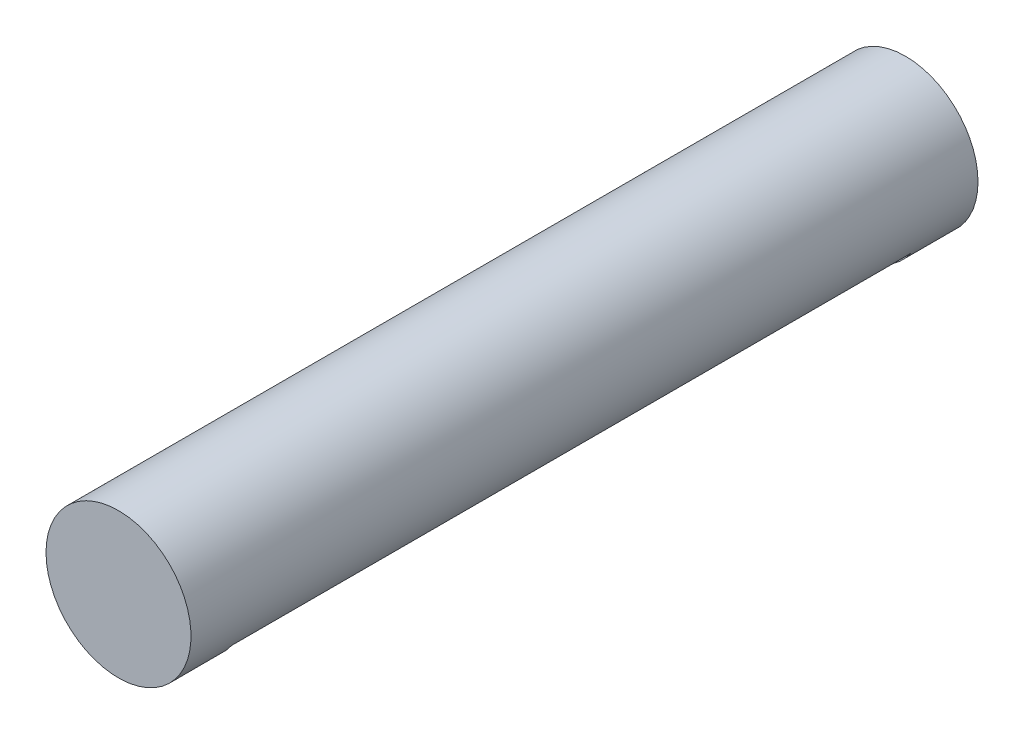
ISO-10303-21;
HEADER;
FILE_DESCRIPTION(('STEP AP214'),'2;1');
FILE_NAME('part.step','',(''),(''),'','','');
FILE_SCHEMA(('AUTOMOTIVE_DESIGN { 1 0 10303 214 1 1 1 1 }'));
ENDSEC;
DATA;
#1=APPLICATION_CONTEXT('core data for automotive mechanical design processes');
#2=APPLICATION_PROTOCOL_DEFINITION('international standard','automotive_design',2000,#1);
#3=PRODUCT_CONTEXT('',#1,'mechanical');
#4=PRODUCT('Part','Part','',(#3));
#5=PRODUCT_RELATED_PRODUCT_CATEGORY('part','',(#4));
#6=PRODUCT_DEFINITION_FORMATION('','',#4);
#7=PRODUCT_DEFINITION_CONTEXT('part definition',#1,'design');
#8=PRODUCT_DEFINITION('design','',#6,#7);
#9=PRODUCT_DEFINITION_SHAPE('','',#8);
#10=(LENGTH_UNIT() NAMED_UNIT(*) SI_UNIT(.MILLI.,.METRE.));
#11=(NAMED_UNIT(*) PLANE_ANGLE_UNIT() SI_UNIT($,.RADIAN.));
#12=(NAMED_UNIT(*) SI_UNIT($,.STERADIAN.) SOLID_ANGLE_UNIT());
#13=UNCERTAINTY_MEASURE_WITH_UNIT(LENGTH_MEASURE(1.E-05),#10,'distance_accuracy_value','');
#14=(GEOMETRIC_REPRESENTATION_CONTEXT(3) GLOBAL_UNCERTAINTY_ASSIGNED_CONTEXT((#13)) GLOBAL_UNIT_ASSIGNED_CONTEXT((#10,
#11,#12)) REPRESENTATION_CONTEXT('',''));
#15=CARTESIAN_POINT('',(0.,0.,0.));
#16=DIRECTION('',(0.,0.,1.));
#17=DIRECTION('',(1.,0.,0.));
#18=AXIS2_PLACEMENT_3D('',#15,#16,#17);
#19=CARTESIAN_POINT('',(200.,-240.,478.994949366117));
#20=DIRECTION('',(0.,0.,-1.));
#21=DIRECTION('',(-1.,0.,0.));
#22=AXIS2_PLACEMENT_3D('',#19,#20,#21);
#23=CYLINDRICAL_SURFACE('',#22,35.);
#24=CARTESIAN_POINT('',(200.,-240.,0.));
#25=DIRECTION('',(0.,0.,1.));
#26=DIRECTION('',(1.,0.,0.));
#27=AXIS2_PLACEMENT_3D('',#24,#25,#26);
#28=CIRCLE('',#27,35.);
#29=CARTESIAN_POINT('',(235.,-240.,0.));
#30=VERTEX_POINT('',#29);
#31=EDGE_CURVE('E81',#30,#30,#28,.T.);
#32=ORIENTED_EDGE('',*,*,#31,.T.);
#33=EDGE_LOOP('',(#32));
#34=FACE_BOUND('',#33,.T.);
#35=CARTESIAN_POINT('',(200.,-240.,380.));
#36=DIRECTION('',(0.,0.,-1.));
#37=DIRECTION('',(-1.,0.,0.));
#38=AXIS2_PLACEMENT_3D('',#35,#36,#37);
#39=CIRCLE('',#38,35.);
#40=CARTESIAN_POINT('',(165.,-240.,380.));
#41=VERTEX_POINT('',#40);
#42=EDGE_CURVE('E84',#41,#41,#39,.T.);
#43=ORIENTED_EDGE('',*,*,#42,.T.);
#44=EDGE_LOOP('',(#43));
#45=FACE_BOUND('',#44,.T.);
#46=DIRECTION('',(0.,0.,-1.));
#47=VECTOR('',#46,1.);
#48=CARTESIAN_POINT('',(228.72281323269,-260.,478.994949366117));
#49=LINE('',#48,#47);
#50=CARTESIAN_POINT('',(228.72281323269,-260.,354.));
#51=VERTEX_POINT('',#50);
#52=CARTESIAN_POINT('',(228.72281323269,-260.,26.));
#53=VERTEX_POINT('',#52);
#54=EDGE_CURVE('E13',#51,#53,#49,.T.);
#55=ORIENTED_EDGE('',*,*,#54,.T.);
#56=CARTESIAN_POINT('',(200.,-240.,26.));
#57=DIRECTION('',(0.,0.,1.));
#58=DIRECTION('',(1.,0.,0.));
#59=AXIS2_PLACEMENT_3D('',#56,#57,#58);
#60=CIRCLE('',#59,35.);
#61=CARTESIAN_POINT('',(171.27718676731,-260.,26.));
#62=VERTEX_POINT('',#61);
#63=EDGE_CURVE('E53',#62,#53,#60,.T.);
#64=ORIENTED_EDGE('',*,*,#63,.F.);
#65=DIRECTION('',(0.,0.,-1.));
#66=VECTOR('',#65,1.);
#67=CARTESIAN_POINT('',(171.27718676731,-260.,478.994949366117));
#68=LINE('',#67,#66);
#69=CARTESIAN_POINT('',(171.27718676731,-260.,354.));
#70=VERTEX_POINT('',#69);
#71=EDGE_CURVE('E75',#62,#70,#68,.F.);
#72=ORIENTED_EDGE('',*,*,#71,.T.);
#73=CARTESIAN_POINT('',(200.,-240.,354.));
#74=DIRECTION('',(0.,0.,-1.));
#75=DIRECTION('',(-1.,0.,0.));
#76=AXIS2_PLACEMENT_3D('',#73,#74,#75);
#77=CIRCLE('',#76,35.);
#78=EDGE_CURVE('E74',#51,#70,#77,.T.);
#79=ORIENTED_EDGE('',*,*,#78,.F.);
#80=EDGE_LOOP('',(#55,#64,#72,#79));
#81=FACE_BOUND('',#80,.T.);
#82=ADVANCED_FACE('F46',(#34,#45,#81),#23,.T.);
#83=CARTESIAN_POINT('',(200.,-240.,0.));
#84=DIRECTION('',(0.,0.,1.));
#85=DIRECTION('',(1.,0.,0.));
#86=AXIS2_PLACEMENT_3D('',#83,#84,#85);
#87=PLANE('',#86);
#88=ORIENTED_EDGE('',*,*,#31,.F.);
#89=EDGE_LOOP('',(#88));
#90=FACE_BOUND('',#89,.T.);
#91=ADVANCED_FACE('F96',(#90),#87,.F.);
#92=CARTESIAN_POINT('',(200.,-240.,380.));
#93=DIRECTION('',(0.,0.,-1.));
#94=DIRECTION('',(-1.,0.,0.));
#95=AXIS2_PLACEMENT_3D('',#92,#93,#94);
#96=PLANE('',#95);
#97=ORIENTED_EDGE('',*,*,#42,.F.);
#98=EDGE_LOOP('',(#97));
#99=FACE_BOUND('',#98,.T.);
#100=ADVANCED_FACE('F93',(#99),#96,.F.);
#101=CARTESIAN_POINT('',(141.640941810884,-275.,26.));
#102=DIRECTION('',(0.,0.,1.));
#103=DIRECTION('',(1.,0.,0.));
#104=AXIS2_PLACEMENT_3D('',#101,#102,#103);
#105=PLANE('',#104);
#106=ORIENTED_EDGE('',*,*,#63,.T.);
#107=DIRECTION('',(1.,0.,0.));
#108=VECTOR('',#107,1.);
#109=CARTESIAN_POINT('',(141.640941810884,-260.,26.));
#110=LINE('',#109,#108);
#111=EDGE_CURVE('E79',#62,#53,#110,.T.);
#112=ORIENTED_EDGE('',*,*,#111,.F.);
#113=EDGE_LOOP('',(#106,#112));
#114=FACE_BOUND('',#113,.T.);
#115=ADVANCED_FACE('F95',(#114),#105,.T.);
#116=CARTESIAN_POINT('',(141.640941810884,-275.,354.));
#117=DIRECTION('',(0.,0.,-1.));
#118=DIRECTION('',(-1.,0.,0.));
#119=AXIS2_PLACEMENT_3D('',#116,#117,#118);
#120=PLANE('',#119);
#121=DIRECTION('',(-1.,0.,0.));
#122=VECTOR('',#121,1.);
#123=CARTESIAN_POINT('',(141.640941810884,-260.,354.));
#124=LINE('',#123,#122);
#125=EDGE_CURVE('E60',#51,#70,#124,.T.);
#126=ORIENTED_EDGE('',*,*,#125,.F.);
#127=ORIENTED_EDGE('',*,*,#78,.T.);
#128=EDGE_LOOP('',(#126,#127));
#129=FACE_BOUND('',#128,.T.);
#130=ADVANCED_FACE('F80',(#129),#120,.T.);
#131=CARTESIAN_POINT('',(0.,-260.,0.));
#132=DIRECTION('',(0.,1.,0.));
#133=DIRECTION('',(0.,0.,1.));
#134=AXIS2_PLACEMENT_3D('',#131,#132,#133);
#135=PLANE('',#134);
#136=ORIENTED_EDGE('',*,*,#125,.T.);
#137=ORIENTED_EDGE('',*,*,#71,.F.);
#138=ORIENTED_EDGE('',*,*,#111,.T.);
#139=ORIENTED_EDGE('',*,*,#54,.F.);
#140=EDGE_LOOP('',(#136,#137,#138,#139));
#141=FACE_BOUND('',#140,.T.);
#142=ADVANCED_FACE('F78',(#141),#135,.F.);
#143=CLOSED_SHELL('',(#82,#91,#100,#115,#130,#142));
#144=MANIFOLD_SOLID_BREP('B2',#143);
#145=ADVANCED_BREP_SHAPE_REPRESENTATION('',(#18,#144),#14);
#146=SHAPE_DEFINITION_REPRESENTATION(#9,#145);
ENDSEC;
END-ISO-10303-21;
